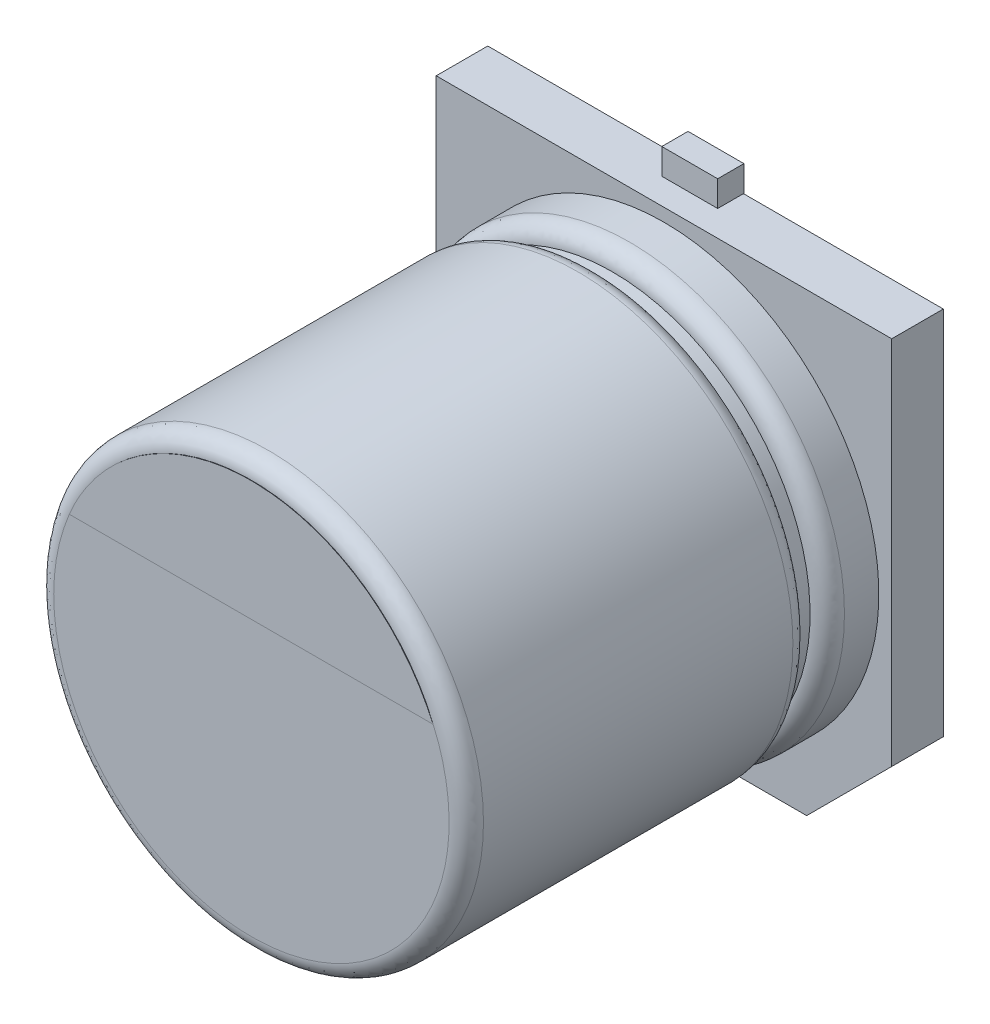
ISO-10303-21;
HEADER;
FILE_DESCRIPTION(('STEP AP214'),'2;1');
FILE_NAME('part.step','',(''),(''),'','','');
FILE_SCHEMA(('AUTOMOTIVE_DESIGN { 1 0 10303 214 1 1 1 1 }'));
ENDSEC;
DATA;
#1=APPLICATION_CONTEXT('core data for automotive mechanical design processes');
#2=APPLICATION_PROTOCOL_DEFINITION('international standard','automotive_design',2000,#1);
#3=PRODUCT_CONTEXT('',#1,'mechanical');
#4=PRODUCT('Part','Part','',(#3));
#5=PRODUCT_RELATED_PRODUCT_CATEGORY('part','',(#4));
#6=PRODUCT_DEFINITION_FORMATION('','',#4);
#7=PRODUCT_DEFINITION_CONTEXT('part definition',#1,'design');
#8=PRODUCT_DEFINITION('design','',#6,#7);
#9=PRODUCT_DEFINITION_SHAPE('','',#8);
#10=(LENGTH_UNIT() NAMED_UNIT(*) SI_UNIT(.MILLI.,.METRE.));
#11=(NAMED_UNIT(*) PLANE_ANGLE_UNIT() SI_UNIT($,.RADIAN.));
#12=(NAMED_UNIT(*) SI_UNIT($,.STERADIAN.) SOLID_ANGLE_UNIT());
#13=UNCERTAINTY_MEASURE_WITH_UNIT(LENGTH_MEASURE(1.E-05),#10,'distance_accuracy_value','');
#14=(GEOMETRIC_REPRESENTATION_CONTEXT(3) GLOBAL_UNCERTAINTY_ASSIGNED_CONTEXT((#13)) GLOBAL_UNIT_ASSIGNED_CONTEXT((#10,
#11,#12)) REPRESENTATION_CONTEXT('',''));
#15=CARTESIAN_POINT('',(0.,0.,0.));
#16=DIRECTION('',(0.,0.,1.));
#17=DIRECTION('',(1.,0.,0.));
#18=AXIS2_PLACEMENT_3D('',#15,#16,#17);
#19=CARTESIAN_POINT('',(0.325,0.,0.));
#20=DIRECTION('',(1.,0.,0.));
#21=DIRECTION('',(0.,0.,-1.));
#22=AXIS2_PLACEMENT_3D('',#19,#20,#21);
#23=PLANE('',#22);
#24=DIRECTION('',(0.,0.,-1.));
#25=VECTOR('',#24,1.);
#26=CARTESIAN_POINT('',(0.325,2.95,0.));
#27=LINE('',#26,#25);
#28=CARTESIAN_POINT('',(0.325,2.95,-0.005));
#29=VERTEX_POINT('',#28);
#30=CARTESIAN_POINT('',(0.325,2.95,0.3));
#31=VERTEX_POINT('',#30);
#32=EDGE_CURVE('E176',#29,#31,#27,.F.);
#33=ORIENTED_EDGE('',*,*,#32,.T.);
#34=DIRECTION('',(0.,1.,0.));
#35=VECTOR('',#34,1.);
#36=CARTESIAN_POINT('',(0.325,0.,0.3));
#37=LINE('',#36,#35);
#38=CARTESIAN_POINT('',(0.325,2.65,0.3));
#39=VERTEX_POINT('',#38);
#40=EDGE_CURVE('E381',#31,#39,#37,.F.);
#41=ORIENTED_EDGE('',*,*,#40,.T.);
#42=DIRECTION('',(0.,0.,-1.));
#43=VECTOR('',#42,1.);
#44=CARTESIAN_POINT('',(0.325,2.65,0.));
#45=LINE('',#44,#43);
#46=CARTESIAN_POINT('',(0.325,2.65,0.));
#47=VERTEX_POINT('',#46);
#48=EDGE_CURVE('E372',#39,#47,#45,.T.);
#49=ORIENTED_EDGE('',*,*,#48,.T.);
#50=DIRECTION('',(0.,1.,0.));
#51=VECTOR('',#50,1.);
#52=CARTESIAN_POINT('',(0.325,0.,0.));
#53=LINE('',#52,#51);
#54=CARTESIAN_POINT('',(0.325,1.075,-0.0025));
#55=VERTEX_POINT('',#54);
#56=EDGE_CURVE('E368',#47,#55,#53,.F.);
#57=ORIENTED_EDGE('',*,*,#56,.T.);
#58=DIRECTION('',(0.,1.,0.));
#59=VECTOR('',#58,1.);
#60=CARTESIAN_POINT('',(0.325,0.,-0.005));
#61=LINE('',#60,#59);
#62=EDGE_CURVE('E172',#55,#29,#61,.T.);
#63=ORIENTED_EDGE('',*,*,#62,.T.);
#64=EDGE_LOOP('',(#33,#41,#49,#57,#63));
#65=FACE_BOUND('',#64,.T.);
#66=ADVANCED_FACE('F16',(#65),#23,.T.);
#67=CARTESIAN_POINT('',(0.,0.,-0.005));
#68=DIRECTION('',(0.,0.,-1.));
#69=DIRECTION('',(-1.,0.,0.));
#70=AXIS2_PLACEMENT_3D('',#67,#68,#69);
#71=PLANE('',#70);
#72=CARTESIAN_POINT('',(0.325,1.075,-0.005));
#73=CARTESIAN_POINT('',(0.324482939116123,1.0109647520976,-0.005));
#74=CARTESIAN_POINT('',(0.30218119784529,0.955369219392391,-0.005));
#75=CARTESIAN_POINT('',(0.276561643957543,0.891502782742353,-0.005));
#76=CARTESIAN_POINT('',(0.229809703885628,0.845190296114372,-0.005));
#77=CARTESIAN_POINT('',(0.134815069973065,0.751088581703416,-0.005));
#78=CARTESIAN_POINT('',(0.,0.75,-0.005));
#79=B_SPLINE_CURVE_WITH_KNOTS('',2,(#72,#73,#74,#75,#76,#77,#78),.UNSPECIFIED.,.F.,.F.,(3,2,2,
3),(0.,0.25,0.5,1.),.UNSPECIFIED.);
#80=CARTESIAN_POINT('',(0.,0.75,-0.0025));
#81=VERTEX_POINT('',#80);
#82=EDGE_CURVE('E401',#55,#81,#79,.T.);
#83=ORIENTED_EDGE('',*,*,#82,.T.);
#84=CARTESIAN_POINT('',(0.,0.75,-0.005));
#85=CARTESIAN_POINT('',(-0.0640352479023781,0.750517060883877,-0.005));
#86=CARTESIAN_POINT('',(-0.119630780607609,0.77281880215471,-0.005));
#87=CARTESIAN_POINT('',(-0.183497217257633,0.798438356042444,-0.005));
#88=CARTESIAN_POINT('',(-0.229809703885628,0.845190296114372,-0.005));
#89=CARTESIAN_POINT('',(-0.323911418296585,0.940184930026933,-0.005));
#90=CARTESIAN_POINT('',(-0.325,1.075,-0.005));
#91=B_SPLINE_CURVE_WITH_KNOTS('',2,(#84,#85,#86,#87,#88,#89,#90),.UNSPECIFIED.,.F.,.F.,(3,2,2,
3),(0.,0.25,0.5,1.),.UNSPECIFIED.);
#92=CARTESIAN_POINT('',(-0.325,1.075,-0.0025));
#93=VERTEX_POINT('',#92);
#94=EDGE_CURVE('E169',#81,#93,#91,.T.);
#95=ORIENTED_EDGE('',*,*,#94,.T.);
#96=DIRECTION('',(0.,1.,0.));
#97=VECTOR('',#96,1.);
#98=CARTESIAN_POINT('',(-0.325,0.,-0.005));
#99=LINE('',#98,#97);
#100=CARTESIAN_POINT('',(-0.325,2.95,-0.005));
#101=VERTEX_POINT('',#100);
#102=EDGE_CURVE('E153',#93,#101,#99,.T.);
#103=ORIENTED_EDGE('',*,*,#102,.T.);
#104=DIRECTION('',(1.,0.,0.));
#105=VECTOR('',#104,1.);
#106=CARTESIAN_POINT('',(0.,2.95,-0.005));
#107=LINE('',#106,#105);
#108=EDGE_CURVE('E161',#101,#29,#107,.T.);
#109=ORIENTED_EDGE('',*,*,#108,.T.);
#110=ORIENTED_EDGE('',*,*,#62,.F.);
#111=EDGE_LOOP('',(#83,#95,#103,#109,#110));
#112=FACE_BOUND('',#111,.T.);
#113=ADVANCED_FACE('F165',(#112),#71,.T.);
#114=CARTESIAN_POINT('',(-0.325,0.,0.));
#115=DIRECTION('',(-1.,0.,0.));
#116=DIRECTION('',(0.,0.,1.));
#117=AXIS2_PLACEMENT_3D('',#114,#115,#116);
#118=PLANE('',#117);
#119=DIRECTION('',(0.,0.,-1.));
#120=VECTOR('',#119,1.);
#121=CARTESIAN_POINT('',(-0.325,2.95,0.));
#122=LINE('',#121,#120);
#123=CARTESIAN_POINT('',(-0.325,2.95,0.3));
#124=VERTEX_POINT('',#123);
#125=EDGE_CURVE('E150',#124,#101,#122,.T.);
#126=ORIENTED_EDGE('',*,*,#125,.T.);
#127=ORIENTED_EDGE('',*,*,#102,.F.);
#128=DIRECTION('',(0.,1.,0.));
#129=VECTOR('',#128,1.);
#130=CARTESIAN_POINT('',(-0.325,0.,0.));
#131=LINE('',#130,#129);
#132=CARTESIAN_POINT('',(-0.325,2.65,0.));
#133=VERTEX_POINT('',#132);
#134=EDGE_CURVE('E362',#93,#133,#131,.T.);
#135=ORIENTED_EDGE('',*,*,#134,.T.);
#136=DIRECTION('',(0.,0.,-1.));
#137=VECTOR('',#136,1.);
#138=CARTESIAN_POINT('',(-0.325,2.65,0.));
#139=LINE('',#138,#137);
#140=CARTESIAN_POINT('',(-0.325,2.65,0.3));
#141=VERTEX_POINT('',#140);
#142=EDGE_CURVE('E353',#133,#141,#139,.F.);
#143=ORIENTED_EDGE('',*,*,#142,.T.);
#144=DIRECTION('',(0.,1.,0.));
#145=VECTOR('',#144,1.);
#146=CARTESIAN_POINT('',(-0.325,0.,0.3));
#147=LINE('',#146,#145);
#148=EDGE_CURVE('E156',#141,#124,#147,.T.);
#149=ORIENTED_EDGE('',*,*,#148,.T.);
#150=EDGE_LOOP('',(#126,#127,#135,#143,#149));
#151=FACE_BOUND('',#150,.T.);
#152=ADVANCED_FACE('F152',(#151),#118,.T.);
#153=CARTESIAN_POINT('',(0.,0.,5.405));
#154=DIRECTION('',(0.,0.,1.));
#155=DIRECTION('',(1.,0.,0.));
#156=AXIS2_PLACEMENT_3D('',#153,#154,#155);
#157=PLANE('',#156);
#158=CARTESIAN_POINT('',(2.11660104886832,0.899999999967473,5.405));
#159=CARTESIAN_POINT('',(2.0041326346796,1.16417853972968,5.405));
#160=CARTESIAN_POINT('',(1.831291189622,1.3915360501348,5.405));
#161=CARTESIAN_POINT('',(1.63325315574933,1.65203742659465,5.405));
#162=CARTESIAN_POINT('',(1.37131898941314,1.84647887323057,5.405));
#163=CARTESIAN_POINT('',(1.08135325347939,2.06172897961586,5.405));
#164=CARTESIAN_POINT('',(0.740407971465138,2.17756653992543,5.405));
#165=CARTESIAN_POINT('',(0.379799854123385,2.30008462932063,5.405));
#166=CARTESIAN_POINT('',(-1.49264281490424E-11,2.30000000000259,5.405));
#167=CARTESIAN_POINT('',(-0.380853548795481,2.29991513589389,5.405));
#168=CARTESIAN_POINT('',(-0.740407971493402,2.17756653991582,5.405));
#169=CARTESIAN_POINT('',(-1.08228326171758,2.06123377047116,5.405));
#170=CARTESIAN_POINT('',(-1.37131898943711,1.84647887321277,5.405));
#171=CARTESIAN_POINT('',(-1.6339831199148,1.65131819602155,5.405));
#172=CARTESIAN_POINT('',(-1.83129118964006,1.39153605011103,5.405));
#173=CARTESIAN_POINT('',(-2.0043371246723,1.16369821050131,5.405));
#174=CARTESIAN_POINT('',(-2.11660104888,0.89999999994,5.405));
#175=B_SPLINE_CURVE_WITH_KNOTS('',2,(#158,#159,#160,#161,#162,#163,#164,#165,#166,#167,#168,
#169,#170,#171,#172,#173,#174),.UNSPECIFIED.,.F.,.F.,(3,2,2,2,2,2,2,2,3),(0.,0.125,0.25,0.375,
0.5,0.625,0.75,0.875,1.),.UNSPECIFIED.);
#176=CARTESIAN_POINT('',(2.11660104888334,0.900000000092898,5.4025));
#177=VERTEX_POINT('',#176);
#178=CARTESIAN_POINT('',(-2.11660104893173,0.899999999983,5.4025));
#179=VERTEX_POINT('',#178);
#180=EDGE_CURVE('E298',#177,#179,#175,.T.);
#181=ORIENTED_EDGE('',*,*,#180,.T.);
#182=CARTESIAN_POINT('',(-2.116601049,0.9,5.405));
#183=DIRECTION('',(1.,0.,0.));
#184=VECTOR('',#183,1.);
#185=LINE('',#182,#184);
#186=EDGE_CURVE('E171',#179,#177,#185,.T.);
#187=ORIENTED_EDGE('',*,*,#186,.T.);
#188=EDGE_LOOP('',(#181,#187));
#189=FACE_BOUND('',#188,.T.);
#190=ADVANCED_FACE('F305',(#189),#157,.T.);
#191=CARTESIAN_POINT('',(0.,0.,5.4));
#192=DIRECTION('',(0.,0.,-1.));
#193=DIRECTION('',(-1.,0.,0.));
#194=AXIS2_PLACEMENT_3D('',#191,#192,#193);
#195=PLANE('',#194);
#196=CARTESIAN_POINT('',(0.,0.,5.4));
#197=DIRECTION('',(0.,0.,-1.));
#198=DIRECTION('',(0.877582561894354,-0.479425538596915,0.));
#199=AXIS2_PLACEMENT_3D('',#196,#197,#198);
#200=CIRCLE('',#199,2.3000000000148);
#201=CARTESIAN_POINT('',(2.01843989217057,-1.10267873904342,5.4));
#202=VERTEX_POINT('',#201);
#203=EDGE_CURVE('E903',#179,#202,#200,.F.);
#204=ORIENTED_EDGE('',*,*,#203,.T.);
#205=CARTESIAN_POINT('',(0.,0.,5.4));
#206=DIRECTION('',(0.,0.,-1.));
#207=DIRECTION('',(0.92026132551006,0.391304348008641,0.));
#208=AXIS2_PLACEMENT_3D('',#205,#206,#207);
#209=CIRCLE('',#208,2.3000000000148);
#210=EDGE_CURVE('E901',#202,#177,#209,.F.);
#211=ORIENTED_EDGE('',*,*,#210,.T.);
#212=ORIENTED_EDGE('',*,*,#186,.F.);
#213=EDGE_LOOP('',(#204,#211,#212));
#214=FACE_BOUND('',#213,.T.);
#215=ADVANCED_FACE('F314',(#214),#195,.F.);
#216=CARTESIAN_POINT('',(0.,0.,5.4));
#217=DIRECTION('',(0.,0.,1.));
#218=DIRECTION('',(1.,0.,0.));
#219=AXIS2_PLACEMENT_3D('',#216,#217,#218);
#220=CYLINDRICAL_SURFACE('',#219,2.3000000001365);
#221=CARTESIAN_POINT('',(0.,0.,5.4));
#222=DIRECTION('',(0.,0.,-1.));
#223=DIRECTION('',(-0.877582561817134,0.479425538738266,0.));
#224=AXIS2_PLACEMENT_3D('',#221,#222,#223);
#225=CIRCLE('',#224,2.30000000000259);
#226=EDGE_CURVE('E264',#177,#179,#225,.F.);
#227=ORIENTED_EDGE('',*,*,#226,.T.);
#228=ORIENTED_EDGE('',*,*,#180,.F.);
#229=EDGE_LOOP('',(#227,#228));
#230=FACE_BOUND('',#229,.T.);
#231=ADVANCED_FACE('F277',(#230),#220,.T.);
#232=CARTESIAN_POINT('',(-2.018439892,1.102678739,5.4));
#233=CARTESIAN_POINT('',(-2.12125508453112,1.15884693467241,5.4));
#234=CARTESIAN_POINT('',(-2.19395640437887,1.19856384671938,5.31715728752538));
#235=CARTESIAN_POINT('',(-2.19395640437887,1.19856384671938,5.2));
#236=(BOUNDED_CURVE() B_SPLINE_CURVE(3,(#232,#233,#234,#235),.UNSPECIFIED.,.F.,
.F.) B_SPLINE_CURVE_WITH_KNOTS((4,4),(0.,1.),
.UNSPECIFIED.) CURVE() GEOMETRIC_REPRESENTATION_ITEM() RATIONAL_B_SPLINE_CURVE((1.,
0.804737854124365,0.804737854124365,1.)) REPRESENTATION_ITEM(''));
#237=CARTESIAN_POINT('',(0.,0.,5.2));
#238=DIRECTION('',(0.,0.,-1.));
#239=AXIS1_PLACEMENT('',#237,#238);
#240=SURFACE_OF_REVOLUTION('',#236,#239);
#241=ORIENTED_EDGE('',*,*,#210,.F.);
#242=ORIENTED_EDGE('',*,*,#203,.F.);
#243=ORIENTED_EDGE('',*,*,#226,.F.);
#244=EDGE_LOOP('',(#241,#242,#243));
#245=FACE_BOUND('',#244,.T.);
#246=CARTESIAN_POINT('',(0.,0.,5.2));
#247=DIRECTION('',(0.,0.,-1.));
#248=DIRECTION('',(-0.877582561833192,0.479425538708872,0.));
#249=AXIS2_PLACEMENT_3D('',#246,#247,#248);
#250=CIRCLE('',#249,2.50000000047519);
#251=CARTESIAN_POINT('',(-2.193956405,1.198563847,5.2));
#252=VERTEX_POINT('',#251);
#253=EDGE_CURVE('E261',#252,#252,#250,.F.);
#254=ORIENTED_EDGE('',*,*,#253,.T.);
#255=EDGE_LOOP('',(#254));
#256=FACE_BOUND('',#255,.T.);
#257=ADVANCED_FACE('F273',(#245,#256),#240,.T.);
#258=CARTESIAN_POINT('',(0.,0.,5.2));
#259=DIRECTION('',(0.,0.,-1.));
#260=DIRECTION('',(-1.,0.,0.));
#261=AXIS2_PLACEMENT_3D('',#258,#259,#260);
#262=CYLINDRICAL_SURFACE('',#261,2.50000000047519);
#263=ORIENTED_EDGE('',*,*,#253,.F.);
#264=EDGE_LOOP('',(#263));
#265=FACE_BOUND('',#264,.T.);
#266=CARTESIAN_POINT('',(0.,0.,1.6));
#267=DIRECTION('',(0.,0.,-1.));
#268=DIRECTION('',(-0.877582561823312,0.479425538726958,0.));
#269=AXIS2_PLACEMENT_3D('',#266,#267,#268);
#270=CIRCLE('',#269,2.49999999979685);
#271=CARTESIAN_POINT('',(-2.19395640438,1.19856384672,1.6));
#272=VERTEX_POINT('',#271);
#273=EDGE_CURVE('E255',#272,#272,#270,.F.);
#274=ORIENTED_EDGE('',*,*,#273,.T.);
#275=EDGE_LOOP('',(#274));
#276=FACE_BOUND('',#275,.T.);
#277=ADVANCED_FACE('F246',(#265,#276),#262,.T.);
#278=CARTESIAN_POINT('',(-2.19395640438,1.19856384672,1.6));
#279=CARTESIAN_POINT('',(-2.19395640438,1.19856384672,1.48284271247386));
#280=CARTESIAN_POINT('',(-2.12125508453178,1.15884693467277,1.39999999999871));
#281=CARTESIAN_POINT('',(-2.018439892,1.102678739,1.39999999999871));
#282=(BOUNDED_CURVE() B_SPLINE_CURVE(3,(#278,#279,#280,#281),.UNSPECIFIED.,.F.,
.F.) B_SPLINE_CURVE_WITH_KNOTS((4,4),(0.,1.),
.UNSPECIFIED.) CURVE() GEOMETRIC_REPRESENTATION_ITEM() RATIONAL_B_SPLINE_CURVE((1.,
0.804737854124363,0.804737854124363,1.)) REPRESENTATION_ITEM(''));
#283=CARTESIAN_POINT('',(0.,0.,1.6));
#284=DIRECTION('',(0.,0.,-1.));
#285=AXIS1_PLACEMENT('',#283,#284);
#286=SURFACE_OF_REVOLUTION('',#282,#285);
#287=ORIENTED_EDGE('',*,*,#273,.F.);
#288=EDGE_LOOP('',(#287));
#289=FACE_BOUND('',#288,.T.);
#290=CARTESIAN_POINT('',(0.,0.,1.4));
#291=DIRECTION('',(0.,0.,-1.));
#292=DIRECTION('',(-0.877582561817134,0.479425538738266,0.));
#293=AXIS2_PLACEMENT_3D('',#290,#291,#292);
#294=CIRCLE('',#293,2.29999999979557);
#295=CARTESIAN_POINT('',(-2.018439892,1.102678739,1.4));
#296=VERTEX_POINT('',#295);
#297=EDGE_CURVE('E253',#296,#296,#294,.F.);
#298=ORIENTED_EDGE('',*,*,#297,.T.);
#299=EDGE_LOOP('',(#298));
#300=FACE_BOUND('',#299,.T.);
#301=ADVANCED_FACE('F241',(#289,#300),#286,.T.);
#302=CARTESIAN_POINT('',(0.,0.,1.4));
#303=DIRECTION('',(0.,0.,-1.));
#304=DIRECTION('',(-1.,0.,0.));
#305=AXIS2_PLACEMENT_3D('',#302,#303,#304);
#306=CYLINDRICAL_SURFACE('',#305,2.29999999979557);
#307=ORIENTED_EDGE('',*,*,#297,.F.);
#308=EDGE_LOOP('',(#307));
#309=FACE_BOUND('',#308,.T.);
#310=CARTESIAN_POINT('',(0.,0.,1.2));
#311=DIRECTION('',(0.,0.,-1.));
#312=DIRECTION('',(-0.877582561817134,0.479425538738266,0.));
#313=AXIS2_PLACEMENT_3D('',#310,#311,#312);
#314=CIRCLE('',#313,2.3000000000148);
#315=CARTESIAN_POINT('',(-2.01843989219239,1.10267873910511,1.2));
#316=VERTEX_POINT('',#315);
#317=EDGE_CURVE('E162',#316,#316,#314,.F.);
#318=ORIENTED_EDGE('',*,*,#317,.T.);
#319=EDGE_LOOP('',(#318));
#320=FACE_BOUND('',#319,.T.);
#321=ADVANCED_FACE('F237',(#309,#320),#306,.T.);
#322=CARTESIAN_POINT('',(-2.018439892,1.102678739,1.2));
#323=CARTESIAN_POINT('',(-2.12125508453112,1.15884693467241,1.2));
#324=CARTESIAN_POINT('',(-2.19395640437887,1.19856384671938,1.11715728752538));
#325=CARTESIAN_POINT('',(-2.19395640437887,1.19856384671938,1.));
#326=(BOUNDED_CURVE() B_SPLINE_CURVE(3,(#322,#323,#324,#325),.UNSPECIFIED.,.F.,
.F.) B_SPLINE_CURVE_WITH_KNOTS((4,4),(0.,1.),
.UNSPECIFIED.) CURVE() GEOMETRIC_REPRESENTATION_ITEM() RATIONAL_B_SPLINE_CURVE((1.,
0.804737854124365,0.804737854124365,1.)) REPRESENTATION_ITEM(''));
#327=CARTESIAN_POINT('',(0.,0.,1.));
#328=DIRECTION('',(0.,0.,-1.));
#329=AXIS1_PLACEMENT('',#327,#328);
#330=SURFACE_OF_REVOLUTION('',#326,#329);
#331=ORIENTED_EDGE('',*,*,#317,.F.);
#332=EDGE_LOOP('',(#331));
#333=FACE_BOUND('',#332,.T.);
#334=CARTESIAN_POINT('',(0.,0.,1.));
#335=DIRECTION('',(0.,0.,-1.));
#336=DIRECTION('',(-0.877582561833192,0.479425538708872,0.));
#337=AXIS2_PLACEMENT_3D('',#334,#335,#336);
#338=CIRCLE('',#337,2.50000000047519);
#339=CARTESIAN_POINT('',(-2.193956405,1.198563847,1.));
#340=VERTEX_POINT('',#339);
#341=EDGE_CURVE('E216',#340,#340,#338,.F.);
#342=ORIENTED_EDGE('',*,*,#341,.T.);
#343=EDGE_LOOP('',(#342));
#344=FACE_BOUND('',#343,.T.);
#345=ADVANCED_FACE('F234',(#333,#344),#330,.T.);
#346=CARTESIAN_POINT('',(0.,2.95,0.));
#347=DIRECTION('',(0.,-1.,0.));
#348=DIRECTION('',(0.,0.,-1.));
#349=AXIS2_PLACEMENT_3D('',#346,#347,#348);
#350=PLANE('',#349);
#351=ORIENTED_EDGE('',*,*,#32,.F.);
#352=ORIENTED_EDGE('',*,*,#108,.F.);
#353=ORIENTED_EDGE('',*,*,#125,.F.);
#354=DIRECTION('',(-1.,0.,0.));
#355=VECTOR('',#354,1.);
#356=CARTESIAN_POINT('',(0.,2.95,0.3));
#357=LINE('',#356,#355);
#358=EDGE_CURVE('E384',#124,#31,#357,.F.);
#359=ORIENTED_EDGE('',*,*,#358,.T.);
#360=EDGE_LOOP('',(#351,#352,#353,#359));
#361=FACE_BOUND('',#360,.T.);
#362=ADVANCED_FACE('F175',(#361),#350,.F.);
#363=CARTESIAN_POINT('',(0.,-2.65,0.));
#364=DIRECTION('',(0.,1.,0.));
#365=DIRECTION('',(0.,0.,1.));
#366=AXIS2_PLACEMENT_3D('',#363,#364,#365);
#367=PLANE('',#366);
#368=DIRECTION('',(1.,0.,0.));
#369=VECTOR('',#368,1.);
#370=CARTESIAN_POINT('',(0.,-2.65,0.3));
#371=LINE('',#370,#369);
#372=CARTESIAN_POINT('',(0.325,-2.65,0.3));
#373=VERTEX_POINT('',#372);
#374=CARTESIAN_POINT('',(-0.325,-2.65,0.3));
#375=VERTEX_POINT('',#374);
#376=EDGE_CURVE('E567',#373,#375,#371,.F.);
#377=ORIENTED_EDGE('',*,*,#376,.F.);
#378=DIRECTION('',(0.,0.,1.));
#379=VECTOR('',#378,1.);
#380=CARTESIAN_POINT('',(0.325,-2.65,0.));
#381=LINE('',#380,#379);
#382=CARTESIAN_POINT('',(0.325,-2.65,0.));
#383=VERTEX_POINT('',#382);
#384=EDGE_CURVE('E631',#383,#373,#381,.T.);
#385=ORIENTED_EDGE('',*,*,#384,.F.);
#386=DIRECTION('',(1.,0.,0.));
#387=VECTOR('',#386,1.);
#388=CARTESIAN_POINT('',(0.,-2.65,0.));
#389=LINE('',#388,#387);
#390=CARTESIAN_POINT('',(1.660050506,-2.65,0.));
#391=VERTEX_POINT('',#390);
#392=EDGE_CURVE('E560',#391,#383,#389,.F.);
#393=ORIENTED_EDGE('',*,*,#392,.F.);
#394=DIRECTION('',(0.,0.,1.));
#395=VECTOR('',#394,1.);
#396=CARTESIAN_POINT('',(1.660050506,-2.65,0.));
#397=LINE('',#396,#395);
#398=CARTESIAN_POINT('',(1.660050506,-2.65,0.6));
#399=VERTEX_POINT('',#398);
#400=EDGE_CURVE('E550',#399,#391,#397,.F.);
#401=ORIENTED_EDGE('',*,*,#400,.F.);
#402=DIRECTION('',(1.,0.,0.));
#403=VECTOR('',#402,1.);
#404=CARTESIAN_POINT('',(0.,-2.65,0.6));
#405=LINE('',#404,#403);
#406=CARTESIAN_POINT('',(-1.66005050598107,-2.64999999998107,0.6));
#407=VERTEX_POINT('',#406);
#408=EDGE_CURVE('E383',#399,#407,#405,.F.);
#409=ORIENTED_EDGE('',*,*,#408,.T.);
#410=DIRECTION('',(0.,0.,1.));
#411=VECTOR('',#410,1.);
#412=CARTESIAN_POINT('',(-1.660050506,-2.65,0.));
#413=LINE('',#412,#411);
#414=CARTESIAN_POINT('',(-1.660050506,-2.65,0.));
#415=VERTEX_POINT('',#414);
#416=EDGE_CURVE('E548',#415,#407,#413,.T.);
#417=ORIENTED_EDGE('',*,*,#416,.F.);
#418=DIRECTION('',(1.,0.,0.));
#419=VECTOR('',#418,1.);
#420=CARTESIAN_POINT('',(0.,-2.65,0.));
#421=LINE('',#420,#419);
#422=CARTESIAN_POINT('',(-0.325,-2.65,0.));
#423=VERTEX_POINT('',#422);
#424=EDGE_CURVE('E178',#423,#415,#421,.F.);
#425=ORIENTED_EDGE('',*,*,#424,.F.);
#426=DIRECTION('',(0.,0.,1.));
#427=VECTOR('',#426,1.);
#428=CARTESIAN_POINT('',(-0.325,-2.65,0.));
#429=LINE('',#428,#427);
#430=EDGE_CURVE('E224',#375,#423,#429,.F.);
#431=ORIENTED_EDGE('',*,*,#430,.F.);
#432=EDGE_LOOP('',(#377,#385,#393,#401,#409,#417,#425,#431));
#433=FACE_BOUND('',#432,.T.);
#434=ADVANCED_FACE('F205',(#433),#367,.F.);
#435=CARTESIAN_POINT('',(0.,0.,1.));
#436=DIRECTION('',(0.,0.,-1.));
#437=DIRECTION('',(-1.,0.,0.));
#438=AXIS2_PLACEMENT_3D('',#435,#436,#437);
#439=CYLINDRICAL_SURFACE('',#438,2.50000000047519);
#440=ORIENTED_EDGE('',*,*,#341,.F.);
#441=EDGE_LOOP('',(#440));
#442=FACE_BOUND('',#441,.T.);
#443=CARTESIAN_POINT('',(0.,0.,0.6));
#444=DIRECTION('',(0.,0.,1.));
#445=DIRECTION('',(-0.877582561833192,0.479425538708872,0.));
#446=AXIS2_PLACEMENT_3D('',#443,#444,#445);
#447=CIRCLE('',#446,2.50000000047519);
#448=CARTESIAN_POINT('',(-2.1939564049,1.1985638468,0.6));
#449=VERTEX_POINT('',#448);
#450=CARTESIAN_POINT('',(2.1939564049,-1.1985638468,0.6));
#451=VERTEX_POINT('',#450);
#452=EDGE_CURVE('E188',#449,#451,#447,.T.);
#453=ORIENTED_EDGE('',*,*,#452,.T.);
#454=CARTESIAN_POINT('',(0.,0.,0.6));
#455=DIRECTION('',(0.,0.,1.));
#456=DIRECTION('',(0.877582561833192,-0.479425538708872,0.));
#457=AXIS2_PLACEMENT_3D('',#454,#455,#456);
#458=CIRCLE('',#457,2.50000000047519);
#459=EDGE_CURVE('E531',#451,#449,#458,.T.);
#460=ORIENTED_EDGE('',*,*,#459,.T.);
#461=EDGE_LOOP('',(#453,#460));
#462=FACE_BOUND('',#461,.T.);
#463=ADVANCED_FACE('F194',(#442,#462),#439,.T.);
#464=CARTESIAN_POINT('',(0.,0.,0.3));
#465=DIRECTION('',(0.,0.,-1.));
#466=DIRECTION('',(-1.,0.,0.));
#467=AXIS2_PLACEMENT_3D('',#464,#465,#466);
#468=PLANE('',#467);
#469=ORIENTED_EDGE('',*,*,#40,.F.);
#470=ORIENTED_EDGE('',*,*,#358,.F.);
#471=ORIENTED_EDGE('',*,*,#148,.F.);
#472=DIRECTION('',(1.,0.,0.));
#473=VECTOR('',#472,1.);
#474=CARTESIAN_POINT('',(0.,2.65,0.3));
#475=LINE('',#474,#473);
#476=EDGE_CURVE('E355',#141,#39,#475,.T.);
#477=ORIENTED_EDGE('',*,*,#476,.T.);
#478=EDGE_LOOP('',(#469,#470,#471,#477));
#479=FACE_BOUND('',#478,.T.);
#480=ADVANCED_FACE('F204',(#479),#468,.F.);
#481=CARTESIAN_POINT('',(0.,0.,0.6));
#482=DIRECTION('',(0.,0.,1.));
#483=DIRECTION('',(1.,0.,0.));
#484=AXIS2_PLACEMENT_3D('',#481,#482,#483);
#485=PLANE('',#484);
#486=ORIENTED_EDGE('',*,*,#452,.F.);
#487=ORIENTED_EDGE('',*,*,#459,.F.);
#488=EDGE_LOOP('',(#486,#487));
#489=FACE_BOUND('',#488,.T.);
#490=DIRECTION('',(0.,1.,0.));
#491=VECTOR('',#490,1.);
#492=CARTESIAN_POINT('',(-2.65,0.,0.6));
#493=LINE('',#492,#491);
#494=CARTESIAN_POINT('',(-2.65,2.65,0.6));
#495=VERTEX_POINT('',#494);
#496=CARTESIAN_POINT('',(-2.64999999998107,-1.66005050598107,0.6));
#497=VERTEX_POINT('',#496);
#498=EDGE_CURVE('E374',#495,#497,#493,.F.);
#499=ORIENTED_EDGE('',*,*,#498,.T.);
#500=DIRECTION('',(-0.707106781186547,0.707106781186547,0.));
#501=VECTOR('',#500,1.);
#502=CARTESIAN_POINT('',(-1.660050506,-2.65,0.6));
#503=LINE('',#502,#501);
#504=EDGE_CURVE('E522',#407,#497,#503,.T.);
#505=ORIENTED_EDGE('',*,*,#504,.F.);
#506=ORIENTED_EDGE('',*,*,#408,.F.);
#507=DIRECTION('',(-0.707106781186548,-0.707106781186548,0.));
#508=VECTOR('',#507,1.);
#509=CARTESIAN_POINT('',(2.15502525292428,-2.15502525292428,0.6));
#510=LINE('',#509,#508);
#511=CARTESIAN_POINT('',(2.64999999998107,-1.66005050598107,0.6));
#512=VERTEX_POINT('',#511);
#513=EDGE_CURVE('E501',#399,#512,#510,.F.);
#514=ORIENTED_EDGE('',*,*,#513,.T.);
#515=DIRECTION('',(0.,1.,0.));
#516=VECTOR('',#515,1.);
#517=CARTESIAN_POINT('',(2.65,0.,0.6));
#518=LINE('',#517,#516);
#519=CARTESIAN_POINT('',(2.65,2.65,0.6));
#520=VERTEX_POINT('',#519);
#521=EDGE_CURVE('E499',#512,#520,#518,.T.);
#522=ORIENTED_EDGE('',*,*,#521,.T.);
#523=DIRECTION('',(1.,0.,0.));
#524=VECTOR('',#523,1.);
#525=CARTESIAN_POINT('',(0.,2.65,0.6));
#526=LINE('',#525,#524);
#527=EDGE_CURVE('E356',#520,#495,#526,.F.);
#528=ORIENTED_EDGE('',*,*,#527,.T.);
#529=EDGE_LOOP('',(#499,#505,#506,#514,#522,#528));
#530=FACE_BOUND('',#529,.T.);
#531=ADVANCED_FACE('F508',(#489,#530),#485,.T.);
#532=CARTESIAN_POINT('',(2.15502525292428,-2.15502525292428,0.));
#533=DIRECTION('',(-0.707106781186548,0.707106781186548,0.));
#534=DIRECTION('',(-0.707106781186548,-0.707106781186548,0.));
#535=AXIS2_PLACEMENT_3D('',#532,#533,#534);
#536=PLANE('',#535);
#537=DIRECTION('',(0.707106781186547,0.707106781186547,0.));
#538=VECTOR('',#537,1.);
#539=CARTESIAN_POINT('',(1.660050506,-2.65,0.));
#540=LINE('',#539,#538);
#541=CARTESIAN_POINT('',(2.64999999996214,-1.66005050596214,0.));
#542=VERTEX_POINT('',#541);
#543=EDGE_CURVE('E483',#391,#542,#540,.T.);
#544=ORIENTED_EDGE('',*,*,#543,.T.);
#545=DIRECTION('',(0.,0.,1.));
#546=VECTOR('',#545,1.);
#547=CARTESIAN_POINT('',(2.65,-1.660050506,0.));
#548=LINE('',#547,#546);
#549=EDGE_CURVE('E496',#542,#512,#548,.T.);
#550=ORIENTED_EDGE('',*,*,#549,.T.);
#551=ORIENTED_EDGE('',*,*,#513,.F.);
#552=ORIENTED_EDGE('',*,*,#400,.T.);
#553=EDGE_LOOP('',(#544,#550,#551,#552));
#554=FACE_BOUND('',#553,.T.);
#555=ADVANCED_FACE('F517',(#554),#536,.F.);
#556=CARTESIAN_POINT('',(2.65,0.,0.));
#557=DIRECTION('',(-1.,0.,0.));
#558=DIRECTION('',(0.,0.,1.));
#559=AXIS2_PLACEMENT_3D('',#556,#557,#558);
#560=PLANE('',#559);
#561=DIRECTION('',(0.,1.,0.));
#562=VECTOR('',#561,1.);
#563=CARTESIAN_POINT('',(2.65,0.,0.));
#564=LINE('',#563,#562);
#565=CARTESIAN_POINT('',(2.65,2.65,0.));
#566=VERTEX_POINT('',#565);
#567=EDGE_CURVE('E369',#542,#566,#564,.T.);
#568=ORIENTED_EDGE('',*,*,#567,.T.);
#569=DIRECTION('',(0.,0.,-1.));
#570=VECTOR('',#569,1.);
#571=CARTESIAN_POINT('',(2.65,2.65,0.));
#572=LINE('',#571,#570);
#573=EDGE_CURVE('E493',#566,#520,#572,.F.);
#574=ORIENTED_EDGE('',*,*,#573,.T.);
#575=ORIENTED_EDGE('',*,*,#521,.F.);
#576=ORIENTED_EDGE('',*,*,#549,.F.);
#577=EDGE_LOOP('',(#568,#574,#575,#576));
#578=FACE_BOUND('',#577,.T.);
#579=ADVANCED_FACE('F652',(#578),#560,.F.);
#580=CARTESIAN_POINT('',(0.,2.65,0.));
#581=DIRECTION('',(0.,-1.,0.));
#582=DIRECTION('',(0.,0.,-1.));
#583=AXIS2_PLACEMENT_3D('',#580,#581,#582);
#584=PLANE('',#583);
#585=ORIENTED_EDGE('',*,*,#476,.F.);
#586=ORIENTED_EDGE('',*,*,#142,.F.);
#587=DIRECTION('',(1.,0.,0.));
#588=VECTOR('',#587,1.);
#589=CARTESIAN_POINT('',(0.,2.65,0.));
#590=LINE('',#589,#588);
#591=CARTESIAN_POINT('',(-2.65,2.65,0.));
#592=VERTEX_POINT('',#591);
#593=EDGE_CURVE('E359',#133,#592,#590,.F.);
#594=ORIENTED_EDGE('',*,*,#593,.T.);
#595=DIRECTION('',(0.,0.,-1.));
#596=VECTOR('',#595,1.);
#597=CARTESIAN_POINT('',(-2.65,2.65,0.));
#598=LINE('',#597,#596);
#599=EDGE_CURVE('E487',#592,#495,#598,.F.);
#600=ORIENTED_EDGE('',*,*,#599,.T.);
#601=ORIENTED_EDGE('',*,*,#527,.F.);
#602=ORIENTED_EDGE('',*,*,#573,.F.);
#603=DIRECTION('',(1.,0.,0.));
#604=VECTOR('',#603,1.);
#605=CARTESIAN_POINT('',(0.,2.65,0.));
#606=LINE('',#605,#604);
#607=EDGE_CURVE('E365',#566,#47,#606,.F.);
#608=ORIENTED_EDGE('',*,*,#607,.T.);
#609=ORIENTED_EDGE('',*,*,#48,.F.);
#610=EDGE_LOOP('',(#585,#586,#594,#600,#601,#602,#608,#609));
#611=FACE_BOUND('',#610,.T.);
#612=ADVANCED_FACE('F655',(#611),#584,.F.);
#613=CARTESIAN_POINT('',(-2.65,0.,0.));
#614=DIRECTION('',(1.,0.,0.));
#615=DIRECTION('',(0.,0.,-1.));
#616=AXIS2_PLACEMENT_3D('',#613,#614,#615);
#617=PLANE('',#616);
#618=DIRECTION('',(0.,1.,0.));
#619=VECTOR('',#618,1.);
#620=CARTESIAN_POINT('',(-2.65,0.,0.));
#621=LINE('',#620,#619);
#622=CARTESIAN_POINT('',(-2.64999999998107,-1.66005050598107,0.));
#623=VERTEX_POINT('',#622);
#624=EDGE_CURVE('E361',#592,#623,#621,.F.);
#625=ORIENTED_EDGE('',*,*,#624,.T.);
#626=DIRECTION('',(0.,0.,1.));
#627=VECTOR('',#626,1.);
#628=CARTESIAN_POINT('',(-2.64999999992427,-1.66005050592428,0.));
#629=LINE('',#628,#627);
#630=EDGE_CURVE('E484',#623,#497,#629,.T.);
#631=ORIENTED_EDGE('',*,*,#630,.T.);
#632=ORIENTED_EDGE('',*,*,#498,.F.);
#633=ORIENTED_EDGE('',*,*,#599,.F.);
#634=EDGE_LOOP('',(#625,#631,#632,#633));
#635=FACE_BOUND('',#634,.T.);
#636=ADVANCED_FACE('F661',(#635),#617,.F.);
#637=CARTESIAN_POINT('',(-2.15502525292428,-2.15502525292428,0.));
#638=DIRECTION('',(0.707106781186548,0.707106781186548,0.));
#639=DIRECTION('',(-0.707106781186548,0.707106781186548,0.));
#640=AXIS2_PLACEMENT_3D('',#637,#638,#639);
#641=PLANE('',#640);
#642=DIRECTION('',(0.707106781186547,-0.707106781186547,0.));
#643=VECTOR('',#642,1.);
#644=CARTESIAN_POINT('',(-2.65,-1.660050506,0.));
#645=LINE('',#644,#643);
#646=EDGE_CURVE('E469',#623,#415,#645,.T.);
#647=ORIENTED_EDGE('',*,*,#646,.T.);
#648=ORIENTED_EDGE('',*,*,#416,.T.);
#649=ORIENTED_EDGE('',*,*,#504,.T.);
#650=ORIENTED_EDGE('',*,*,#630,.F.);
#651=EDGE_LOOP('',(#647,#648,#649,#650));
#652=FACE_BOUND('',#651,.T.);
#653=ADVANCED_FACE('F426',(#652),#641,.F.);
#654=CARTESIAN_POINT('',(0.,0.,0.));
#655=DIRECTION('',(0.,0.,1.));
#656=DIRECTION('',(1.,0.,0.));
#657=AXIS2_PLACEMENT_3D('',#654,#655,#656);
#658=PLANE('',#657);
#659=CARTESIAN_POINT('',(0.,-0.75,-0.005));
#660=CARTESIAN_POINT('',(0.0640352479023892,-0.750517060883877,-0.005));
#661=CARTESIAN_POINT('',(0.119630780607608,-0.77281880215471,-0.005));
#662=CARTESIAN_POINT('',(0.183497217257647,-0.798438356042454,-0.005));
#663=CARTESIAN_POINT('',(0.229809703885628,-0.845190296114372,-0.005));
#664=CARTESIAN_POINT('',(0.323911418296584,-0.94018493002694,-0.005));
#665=CARTESIAN_POINT('',(0.325,-1.075,-0.005));
#666=B_SPLINE_CURVE_WITH_KNOTS('',2,(#659,#660,#661,#662,#663,#664,#665),.UNSPECIFIED.,.F.,.F.,
(3,2,2,3),(0.,0.25,0.5,1.),.UNSPECIFIED.);
#667=CARTESIAN_POINT('',(0.,-0.75,-0.0025));
#668=VERTEX_POINT('',#667);
#669=CARTESIAN_POINT('',(0.325,-1.075,-0.0025));
#670=VERTEX_POINT('',#669);
#671=EDGE_CURVE('E457',#668,#670,#666,.T.);
#672=ORIENTED_EDGE('',*,*,#671,.F.);
#673=CARTESIAN_POINT('',(-0.325,-1.075,-0.005));
#674=CARTESIAN_POINT('',(-0.324482939116123,-1.01096475209761,-0.005));
#675=CARTESIAN_POINT('',(-0.30218119784529,-0.955369219392391,-0.005));
#676=CARTESIAN_POINT('',(-0.276561643957545,-0.891502782742351,-0.005));
#677=CARTESIAN_POINT('',(-0.229809703885628,-0.845190296114372,-0.005));
#678=CARTESIAN_POINT('',(-0.134815069973059,-0.751088581703416,-0.005));
#679=CARTESIAN_POINT('',(0.,-0.75,-0.005));
#680=B_SPLINE_CURVE_WITH_KNOTS('',2,(#673,#674,#675,#676,#677,#678,#679),.UNSPECIFIED.,.F.,.F.,
(3,2,2,3),(0.,0.25,0.5,1.),.UNSPECIFIED.);
#681=CARTESIAN_POINT('',(-0.325,-1.075,-0.0025));
#682=VERTEX_POINT('',#681);
#683=EDGE_CURVE('E448',#682,#668,#680,.T.);
#684=ORIENTED_EDGE('',*,*,#683,.F.);
#685=DIRECTION('',(0.,1.,0.));
#686=VECTOR('',#685,1.);
#687=CARTESIAN_POINT('',(-0.325,0.,0.));
#688=LINE('',#687,#686);
#689=EDGE_CURVE('E466',#423,#682,#688,.T.);
#690=ORIENTED_EDGE('',*,*,#689,.F.);
#691=ORIENTED_EDGE('',*,*,#424,.T.);
#692=ORIENTED_EDGE('',*,*,#646,.F.);
#693=ORIENTED_EDGE('',*,*,#624,.F.);
#694=ORIENTED_EDGE('',*,*,#593,.F.);
#695=ORIENTED_EDGE('',*,*,#134,.F.);
#696=ORIENTED_EDGE('',*,*,#94,.F.);
#697=ORIENTED_EDGE('',*,*,#82,.F.);
#698=ORIENTED_EDGE('',*,*,#56,.F.);
#699=ORIENTED_EDGE('',*,*,#607,.F.);
#700=ORIENTED_EDGE('',*,*,#567,.F.);
#701=ORIENTED_EDGE('',*,*,#543,.F.);
#702=ORIENTED_EDGE('',*,*,#392,.T.);
#703=DIRECTION('',(0.,1.,0.));
#704=VECTOR('',#703,1.);
#705=CARTESIAN_POINT('',(0.325,0.,0.));
#706=LINE('',#705,#704);
#707=EDGE_CURVE('E459',#383,#670,#706,.T.);
#708=ORIENTED_EDGE('',*,*,#707,.T.);
#709=EDGE_LOOP('',(#672,#684,#690,#691,#692,#693,#694,#695,#696,#697,#698,#699,#700,#701,#702,#708));
#710=FACE_BOUND('',#709,.T.);
#711=ADVANCED_FACE('F405',(#710),#658,.F.);
#712=CARTESIAN_POINT('',(0.325,0.,0.));
#713=DIRECTION('',(1.,0.,0.));
#714=DIRECTION('',(0.,0.,-1.));
#715=AXIS2_PLACEMENT_3D('',#712,#713,#714);
#716=PLANE('',#715);
#717=DIRECTION('',(0.,0.,-1.));
#718=VECTOR('',#717,1.);
#719=CARTESIAN_POINT('',(0.325,-2.95,0.));
#720=LINE('',#719,#718);
#721=CARTESIAN_POINT('',(0.325,-2.95,-0.005));
#722=VERTEX_POINT('',#721);
#723=CARTESIAN_POINT('',(0.325,-2.95,0.3));
#724=VERTEX_POINT('',#723);
#725=EDGE_CURVE('E464',#722,#724,#720,.F.);
#726=ORIENTED_EDGE('',*,*,#725,.F.);
#727=DIRECTION('',(0.,1.,0.));
#728=VECTOR('',#727,1.);
#729=CARTESIAN_POINT('',(0.325,0.,-0.005));
#730=LINE('',#729,#728);
#731=EDGE_CURVE('E610',#722,#670,#730,.T.);
#732=ORIENTED_EDGE('',*,*,#731,.T.);
#733=ORIENTED_EDGE('',*,*,#707,.F.);
#734=ORIENTED_EDGE('',*,*,#384,.T.);
#735=DIRECTION('',(0.,1.,0.));
#736=VECTOR('',#735,1.);
#737=CARTESIAN_POINT('',(0.325,0.,0.3));
#738=LINE('',#737,#736);
#739=EDGE_CURVE('E612',#724,#373,#738,.T.);
#740=ORIENTED_EDGE('',*,*,#739,.F.);
#741=EDGE_LOOP('',(#726,#732,#733,#734,#740));
#742=FACE_BOUND('',#741,.T.);
#743=ADVANCED_FACE('F425',(#742),#716,.T.);
#744=CARTESIAN_POINT('',(0.,0.,-0.005));
#745=DIRECTION('',(0.,0.,-1.));
#746=DIRECTION('',(-1.,0.,0.));
#747=AXIS2_PLACEMENT_3D('',#744,#745,#746);
#748=PLANE('',#747);
#749=DIRECTION('',(0.,1.,0.));
#750=VECTOR('',#749,1.);
#751=CARTESIAN_POINT('',(-0.325,0.,-0.005));
#752=LINE('',#751,#750);
#753=CARTESIAN_POINT('',(-0.325,-2.95,-0.005));
#754=VERTEX_POINT('',#753);
#755=EDGE_CURVE('E605',#754,#682,#752,.T.);
#756=ORIENTED_EDGE('',*,*,#755,.T.);
#757=ORIENTED_EDGE('',*,*,#683,.T.);
#758=ORIENTED_EDGE('',*,*,#671,.T.);
#759=ORIENTED_EDGE('',*,*,#731,.F.);
#760=DIRECTION('',(-1.,0.,0.));
#761=VECTOR('',#760,1.);
#762=CARTESIAN_POINT('',(0.,-2.95,-0.005));
#763=LINE('',#762,#761);
#764=EDGE_CURVE('E607',#754,#722,#763,.F.);
#765=ORIENTED_EDGE('',*,*,#764,.F.);
#766=EDGE_LOOP('',(#756,#757,#758,#759,#765));
#767=FACE_BOUND('',#766,.T.);
#768=ADVANCED_FACE('F586',(#767),#748,.T.);
#769=CARTESIAN_POINT('',(-0.325,0.,0.));
#770=DIRECTION('',(-1.,0.,0.));
#771=DIRECTION('',(0.,0.,1.));
#772=AXIS2_PLACEMENT_3D('',#769,#770,#771);
#773=PLANE('',#772);
#774=DIRECTION('',(0.,0.,-1.));
#775=VECTOR('',#774,1.);
#776=CARTESIAN_POINT('',(-0.325,-2.95,0.));
#777=LINE('',#776,#775);
#778=CARTESIAN_POINT('',(-0.325,-2.95,0.3));
#779=VERTEX_POINT('',#778);
#780=EDGE_CURVE('E27',#754,#779,#777,.F.);
#781=ORIENTED_EDGE('',*,*,#780,.T.);
#782=DIRECTION('',(0.,1.,0.));
#783=VECTOR('',#782,1.);
#784=CARTESIAN_POINT('',(-0.325,0.,0.3));
#785=LINE('',#784,#783);
#786=EDGE_CURVE('E606',#779,#375,#785,.T.);
#787=ORIENTED_EDGE('',*,*,#786,.T.);
#788=ORIENTED_EDGE('',*,*,#430,.T.);
#789=ORIENTED_EDGE('',*,*,#689,.T.);
#790=ORIENTED_EDGE('',*,*,#755,.F.);
#791=EDGE_LOOP('',(#781,#787,#788,#789,#790));
#792=FACE_BOUND('',#791,.T.);
#793=ADVANCED_FACE('F581',(#792),#773,.T.);
#794=CARTESIAN_POINT('',(0.,0.,0.3));
#795=DIRECTION('',(0.,0.,-1.));
#796=DIRECTION('',(-1.,0.,0.));
#797=AXIS2_PLACEMENT_3D('',#794,#795,#796);
#798=PLANE('',#797);
#799=ORIENTED_EDGE('',*,*,#786,.F.);
#800=DIRECTION('',(1.,0.,0.));
#801=VECTOR('',#800,1.);
#802=CARTESIAN_POINT('',(0.,-2.95,0.3));
#803=LINE('',#802,#801);
#804=EDGE_CURVE('E10',#779,#724,#803,.T.);
#805=ORIENTED_EDGE('',*,*,#804,.T.);
#806=ORIENTED_EDGE('',*,*,#739,.T.);
#807=ORIENTED_EDGE('',*,*,#376,.T.);
#808=EDGE_LOOP('',(#799,#805,#806,#807));
#809=FACE_BOUND('',#808,.T.);
#810=ADVANCED_FACE('F575',(#809),#798,.F.);
#811=CARTESIAN_POINT('',(0.,-2.95,0.));
#812=DIRECTION('',(0.,-1.,0.));
#813=DIRECTION('',(0.,0.,-1.));
#814=AXIS2_PLACEMENT_3D('',#811,#812,#813);
#815=PLANE('',#814);
#816=ORIENTED_EDGE('',*,*,#780,.F.);
#817=ORIENTED_EDGE('',*,*,#764,.T.);
#818=ORIENTED_EDGE('',*,*,#725,.T.);
#819=ORIENTED_EDGE('',*,*,#804,.F.);
#820=EDGE_LOOP('',(#816,#817,#818,#819));
#821=FACE_BOUND('',#820,.T.);
#822=ADVANCED_FACE('F573',(#821),#815,.T.);
#823=CLOSED_SHELL('',(#66,#113,#152,#190,#215,#231,#257,#277,#301,#321,#345,#362,#434,#463,#480,
#531,#555,#579,#612,#636,#653,#711,#743,#768,#793,#810,#822));
#824=MANIFOLD_SOLID_BREP('B1',#823);
#825=ADVANCED_BREP_SHAPE_REPRESENTATION('',(#18,#824),#14);
#826=SHAPE_DEFINITION_REPRESENTATION(#9,#825);
ENDSEC;
END-ISO-10303-21;
